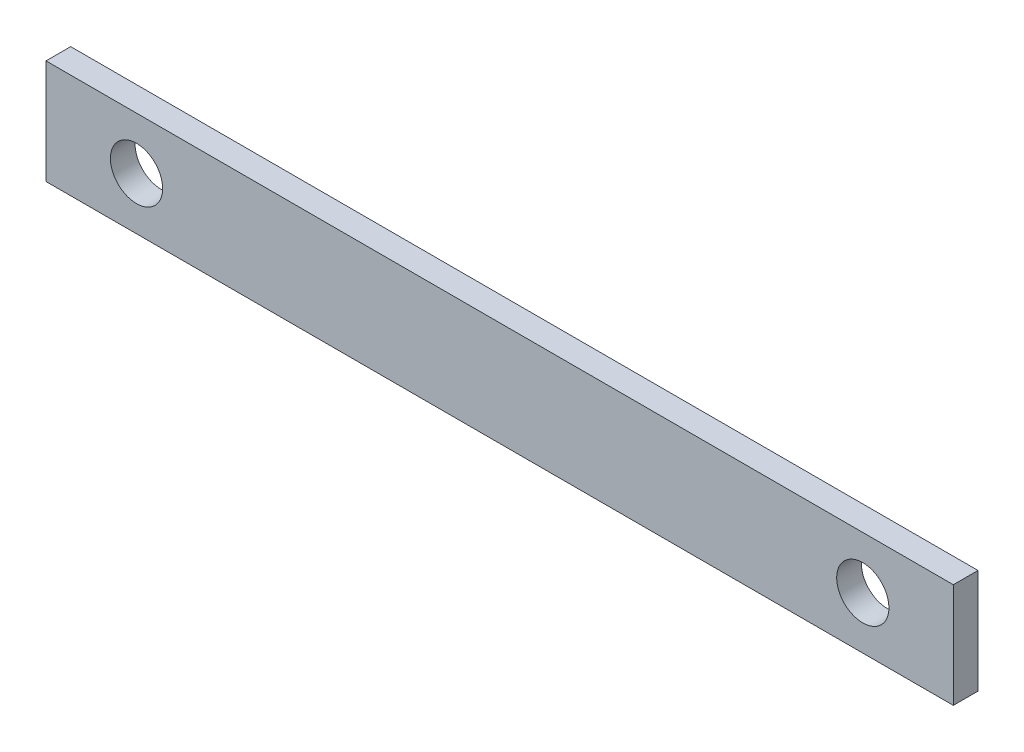
ISO-10303-21;
HEADER;
FILE_DESCRIPTION(('STEP AP214'),'2;1');
FILE_NAME('part.step','',(''),(''),'','','');
FILE_SCHEMA(('AUTOMOTIVE_DESIGN { 1 0 10303 214 1 1 1 1 }'));
ENDSEC;
DATA;
#1=APPLICATION_CONTEXT('core data for automotive mechanical design processes');
#2=APPLICATION_PROTOCOL_DEFINITION('international standard','automotive_design',2000,#1);
#3=PRODUCT_CONTEXT('',#1,'mechanical');
#4=PRODUCT('Part','Part','',(#3));
#5=PRODUCT_RELATED_PRODUCT_CATEGORY('part','',(#4));
#6=PRODUCT_DEFINITION_FORMATION('','',#4);
#7=PRODUCT_DEFINITION_CONTEXT('part definition',#1,'design');
#8=PRODUCT_DEFINITION('design','',#6,#7);
#9=PRODUCT_DEFINITION_SHAPE('','',#8);
#10=(LENGTH_UNIT() NAMED_UNIT(*) SI_UNIT(.MILLI.,.METRE.));
#11=(NAMED_UNIT(*) PLANE_ANGLE_UNIT() SI_UNIT($,.RADIAN.));
#12=(NAMED_UNIT(*) SI_UNIT($,.STERADIAN.) SOLID_ANGLE_UNIT());
#13=UNCERTAINTY_MEASURE_WITH_UNIT(LENGTH_MEASURE(1.E-05),#10,'distance_accuracy_value','');
#14=(GEOMETRIC_REPRESENTATION_CONTEXT(3) GLOBAL_UNCERTAINTY_ASSIGNED_CONTEXT((#13)) GLOBAL_UNIT_ASSIGNED_CONTEXT((#10,
#11,#12)) REPRESENTATION_CONTEXT('',''));
#15=CARTESIAN_POINT('',(0.,0.,0.));
#16=DIRECTION('',(0.,0.,1.));
#17=DIRECTION('',(1.,0.,0.));
#18=AXIS2_PLACEMENT_3D('',#15,#16,#17);
#19=CARTESIAN_POINT('',(0.,0.,0.));
#20=DIRECTION('',(0.,0.,1.));
#21=DIRECTION('',(1.,0.,0.));
#22=AXIS2_PLACEMENT_3D('',#19,#20,#21);
#23=PLANE('',#22);
#24=CARTESIAN_POINT('',(-44.13,0.,0.));
#25=DIRECTION('',(0.,0.,-1.));
#26=DIRECTION('',(-1.,0.,0.));
#27=AXIS2_PLACEMENT_3D('',#24,#25,#26);
#28=CIRCLE('',#27,3.175);
#29=CARTESIAN_POINT('',(-47.305,0.,0.));
#30=VERTEX_POINT('',#29);
#31=EDGE_CURVE('E84',#30,#30,#28,.F.);
#32=ORIENTED_EDGE('',*,*,#31,.T.);
#33=EDGE_LOOP('',(#32));
#34=FACE_BOUND('',#33,.T.);
#35=CARTESIAN_POINT('',(44.13,0.,0.));
#36=DIRECTION('',(0.,0.,-1.));
#37=DIRECTION('',(-1.,0.,0.));
#38=AXIS2_PLACEMENT_3D('',#35,#36,#37);
#39=CIRCLE('',#38,3.175);
#40=CARTESIAN_POINT('',(40.955,0.,0.));
#41=VERTEX_POINT('',#40);
#42=EDGE_CURVE('E20',#41,#41,#39,.F.);
#43=ORIENTED_EDGE('',*,*,#42,.T.);
#44=EDGE_LOOP('',(#43));
#45=FACE_BOUND('',#44,.T.);
#46=DIRECTION('',(1.,0.,0.));
#47=VECTOR('',#46,1.);
#48=CARTESIAN_POINT('',(55.13,6.35000000000001,0.));
#49=LINE('',#48,#47);
#50=CARTESIAN_POINT('',(-55.13,6.35,0.));
#51=VERTEX_POINT('',#50);
#52=CARTESIAN_POINT('',(55.13,6.35000000000001,0.));
#53=VERTEX_POINT('',#52);
#54=EDGE_CURVE('E86',#51,#53,#49,.T.);
#55=ORIENTED_EDGE('',*,*,#54,.T.);
#56=DIRECTION('',(0.,1.,0.));
#57=VECTOR('',#56,1.);
#58=CARTESIAN_POINT('',(55.13,-6.34999999999999,0.));
#59=LINE('',#58,#57);
#60=CARTESIAN_POINT('',(55.13,-6.35,0.));
#61=VERTEX_POINT('',#60);
#62=EDGE_CURVE('E70',#53,#61,#59,.F.);
#63=ORIENTED_EDGE('',*,*,#62,.T.);
#64=DIRECTION('',(-1.,0.,0.));
#65=VECTOR('',#64,1.);
#66=CARTESIAN_POINT('',(55.13,-6.34999999999999,0.));
#67=LINE('',#66,#65);
#68=CARTESIAN_POINT('',(-55.13,-6.35000000000001,0.));
#69=VERTEX_POINT('',#68);
#70=EDGE_CURVE('E55',#61,#69,#67,.T.);
#71=ORIENTED_EDGE('',*,*,#70,.T.);
#72=DIRECTION('',(0.,1.,0.));
#73=VECTOR('',#72,1.);
#74=CARTESIAN_POINT('',(-55.13,-6.35000000000001,0.));
#75=LINE('',#74,#73);
#76=EDGE_CURVE('E60',#69,#51,#75,.T.);
#77=ORIENTED_EDGE('',*,*,#76,.T.);
#78=EDGE_LOOP('',(#55,#63,#71,#77));
#79=FACE_BOUND('',#78,.T.);
#80=ADVANCED_FACE('F17',(#34,#45,#79),#23,.F.);
#81=CARTESIAN_POINT('',(44.13,0.,3.));
#82=DIRECTION('',(0.,0.,-1.));
#83=DIRECTION('',(-1.,0.,0.));
#84=AXIS2_PLACEMENT_3D('',#81,#82,#83);
#85=CYLINDRICAL_SURFACE('',#84,3.175);
#86=CARTESIAN_POINT('',(44.13,0.,3.));
#87=DIRECTION('',(0.,0.,-1.));
#88=DIRECTION('',(-1.,0.,0.));
#89=AXIS2_PLACEMENT_3D('',#86,#87,#88);
#90=CIRCLE('',#89,3.175);
#91=CARTESIAN_POINT('',(40.955,0.,3.));
#92=VERTEX_POINT('',#91);
#93=EDGE_CURVE('E81',#92,#92,#90,.T.);
#94=ORIENTED_EDGE('',*,*,#93,.F.);
#95=EDGE_LOOP('',(#94));
#96=FACE_BOUND('',#95,.T.);
#97=ORIENTED_EDGE('',*,*,#42,.F.);
#98=EDGE_LOOP('',(#97));
#99=FACE_BOUND('',#98,.T.);
#100=ADVANCED_FACE('F160',(#96,#99),#85,.F.);
#101=CARTESIAN_POINT('',(-55.13,-6.35000000000001,3.));
#102=DIRECTION('',(1.,0.,0.));
#103=DIRECTION('',(0.,0.,-1.));
#104=AXIS2_PLACEMENT_3D('',#101,#102,#103);
#105=PLANE('',#104);
#106=DIRECTION('',(0.,0.,1.));
#107=VECTOR('',#106,1.);
#108=CARTESIAN_POINT('',(-55.13,-6.35000000000001,3.));
#109=LINE('',#108,#107);
#110=CARTESIAN_POINT('',(-55.13,-6.35000000000001,3.));
#111=VERTEX_POINT('',#110);
#112=EDGE_CURVE('E62',#69,#111,#109,.T.);
#113=ORIENTED_EDGE('',*,*,#112,.T.);
#114=DIRECTION('',(0.,1.,0.));
#115=VECTOR('',#114,1.);
#116=CARTESIAN_POINT('',(-55.13,0.,3.));
#117=LINE('',#116,#115);
#118=CARTESIAN_POINT('',(-55.13,6.35,3.));
#119=VERTEX_POINT('',#118);
#120=EDGE_CURVE('E83',#119,#111,#117,.F.);
#121=ORIENTED_EDGE('',*,*,#120,.F.);
#122=DIRECTION('',(0.,0.,1.));
#123=VECTOR('',#122,1.);
#124=CARTESIAN_POINT('',(-55.13,6.34999999999999,3.));
#125=LINE('',#124,#123);
#126=EDGE_CURVE('E65',#119,#51,#125,.F.);
#127=ORIENTED_EDGE('',*,*,#126,.T.);
#128=ORIENTED_EDGE('',*,*,#76,.F.);
#129=EDGE_LOOP('',(#113,#121,#127,#128));
#130=FACE_BOUND('',#129,.T.);
#131=ADVANCED_FACE('F61',(#130),#105,.F.);
#132=CARTESIAN_POINT('',(55.13,-6.34999999999999,3.));
#133=DIRECTION('',(0.,1.,0.));
#134=DIRECTION('',(-1.,0.,0.));
#135=AXIS2_PLACEMENT_3D('',#132,#133,#134);
#136=PLANE('',#135);
#137=DIRECTION('',(0.,0.,1.));
#138=VECTOR('',#137,1.);
#139=CARTESIAN_POINT('',(55.13,-6.34999999999999,3.));
#140=LINE('',#139,#138);
#141=CARTESIAN_POINT('',(55.13,-6.35,3.));
#142=VERTEX_POINT('',#141);
#143=EDGE_CURVE('E72',#61,#142,#140,.T.);
#144=ORIENTED_EDGE('',*,*,#143,.T.);
#145=DIRECTION('',(1.,0.,0.));
#146=VECTOR('',#145,1.);
#147=CARTESIAN_POINT('',(0.,-6.35000000000001,3.));
#148=LINE('',#147,#146);
#149=EDGE_CURVE('E76',#111,#142,#148,.T.);
#150=ORIENTED_EDGE('',*,*,#149,.F.);
#151=ORIENTED_EDGE('',*,*,#112,.F.);
#152=ORIENTED_EDGE('',*,*,#70,.F.);
#153=EDGE_LOOP('',(#144,#150,#151,#152));
#154=FACE_BOUND('',#153,.T.);
#155=ADVANCED_FACE('F74',(#154),#136,.F.);
#156=CARTESIAN_POINT('',(55.13,-6.34999999999999,3.));
#157=DIRECTION('',(-1.,0.,0.));
#158=DIRECTION('',(0.,0.,1.));
#159=AXIS2_PLACEMENT_3D('',#156,#157,#158);
#160=PLANE('',#159);
#161=DIRECTION('',(0.,0.,1.));
#162=VECTOR('',#161,1.);
#163=CARTESIAN_POINT('',(55.13,6.35000000000001,3.));
#164=LINE('',#163,#162);
#165=CARTESIAN_POINT('',(55.13,6.35000000000001,3.));
#166=VERTEX_POINT('',#165);
#167=EDGE_CURVE('E35',#53,#166,#164,.T.);
#168=ORIENTED_EDGE('',*,*,#167,.T.);
#169=DIRECTION('',(0.,1.,0.));
#170=VECTOR('',#169,1.);
#171=CARTESIAN_POINT('',(55.13,0.,3.));
#172=LINE('',#171,#170);
#173=EDGE_CURVE('E96',#142,#166,#172,.T.);
#174=ORIENTED_EDGE('',*,*,#173,.F.);
#175=ORIENTED_EDGE('',*,*,#143,.F.);
#176=ORIENTED_EDGE('',*,*,#62,.F.);
#177=EDGE_LOOP('',(#168,#174,#175,#176));
#178=FACE_BOUND('',#177,.T.);
#179=ADVANCED_FACE('F97',(#178),#160,.F.);
#180=CARTESIAN_POINT('',(55.13,6.35000000000001,3.));
#181=DIRECTION('',(0.,-1.,0.));
#182=DIRECTION('',(1.,0.,0.));
#183=AXIS2_PLACEMENT_3D('',#180,#181,#182);
#184=PLANE('',#183);
#185=ORIENTED_EDGE('',*,*,#126,.F.);
#186=DIRECTION('',(1.,0.,0.));
#187=VECTOR('',#186,1.);
#188=CARTESIAN_POINT('',(0.,6.35000000000001,3.));
#189=LINE('',#188,#187);
#190=EDGE_CURVE('E26',#166,#119,#189,.F.);
#191=ORIENTED_EDGE('',*,*,#190,.F.);
#192=ORIENTED_EDGE('',*,*,#167,.F.);
#193=ORIENTED_EDGE('',*,*,#54,.F.);
#194=EDGE_LOOP('',(#185,#191,#192,#193));
#195=FACE_BOUND('',#194,.T.);
#196=ADVANCED_FACE('F105',(#195),#184,.F.);
#197=CARTESIAN_POINT('',(-44.13,0.,3.));
#198=DIRECTION('',(0.,0.,-1.));
#199=DIRECTION('',(-1.,0.,0.));
#200=AXIS2_PLACEMENT_3D('',#197,#198,#199);
#201=CYLINDRICAL_SURFACE('',#200,3.175);
#202=CARTESIAN_POINT('',(-44.13,0.,3.));
#203=DIRECTION('',(0.,0.,-1.));
#204=DIRECTION('',(-1.,0.,0.));
#205=AXIS2_PLACEMENT_3D('',#202,#203,#204);
#206=CIRCLE('',#205,3.175);
#207=CARTESIAN_POINT('',(-47.305,0.,3.));
#208=VERTEX_POINT('',#207);
#209=EDGE_CURVE('E11',#208,#208,#206,.T.);
#210=ORIENTED_EDGE('',*,*,#209,.F.);
#211=EDGE_LOOP('',(#210));
#212=FACE_BOUND('',#211,.T.);
#213=ORIENTED_EDGE('',*,*,#31,.F.);
#214=EDGE_LOOP('',(#213));
#215=FACE_BOUND('',#214,.T.);
#216=ADVANCED_FACE('F107',(#212,#215),#201,.F.);
#217=CARTESIAN_POINT('',(0.,0.,3.));
#218=DIRECTION('',(0.,0.,1.));
#219=DIRECTION('',(1.,0.,0.));
#220=AXIS2_PLACEMENT_3D('',#217,#218,#219);
#221=PLANE('',#220);
#222=ORIENTED_EDGE('',*,*,#209,.T.);
#223=EDGE_LOOP('',(#222));
#224=FACE_BOUND('',#223,.T.);
#225=ORIENTED_EDGE('',*,*,#173,.T.);
#226=ORIENTED_EDGE('',*,*,#190,.T.);
#227=ORIENTED_EDGE('',*,*,#120,.T.);
#228=ORIENTED_EDGE('',*,*,#149,.T.);
#229=EDGE_LOOP('',(#225,#226,#227,#228));
#230=FACE_BOUND('',#229,.T.);
#231=ORIENTED_EDGE('',*,*,#93,.T.);
#232=EDGE_LOOP('',(#231));
#233=FACE_BOUND('',#232,.T.);
#234=ADVANCED_FACE('F101',(#224,#230,#233),#221,.T.);
#235=CLOSED_SHELL('',(#80,#100,#131,#155,#179,#196,#216,#234));
#236=MANIFOLD_SOLID_BREP('B1',#235);
#237=ADVANCED_BREP_SHAPE_REPRESENTATION('',(#18,#236),#14);
#238=SHAPE_DEFINITION_REPRESENTATION(#9,#237);
ENDSEC;
END-ISO-10303-21;
